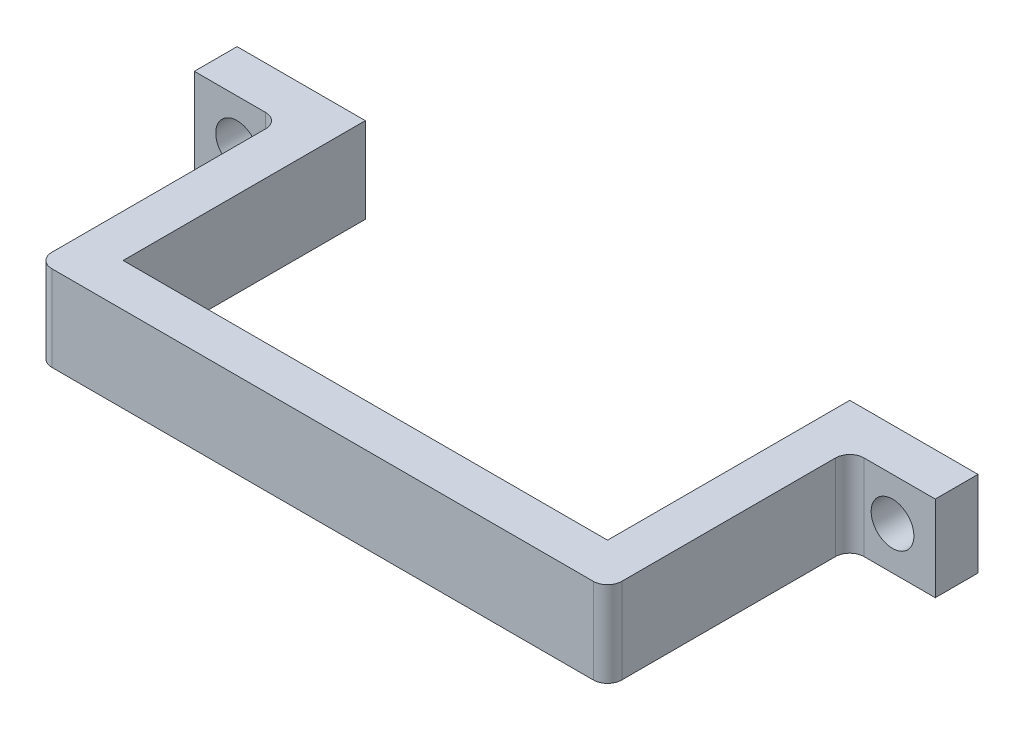
ISO-10303-21;
HEADER;
FILE_DESCRIPTION(('STEP AP214'),'2;1');
FILE_NAME('part.step','',(''),(''),'','','');
FILE_SCHEMA(('AUTOMOTIVE_DESIGN { 1 0 10303 214 1 1 1 1 }'));
ENDSEC;
DATA;
#1=APPLICATION_CONTEXT('core data for automotive mechanical design processes');
#2=APPLICATION_PROTOCOL_DEFINITION('international standard','automotive_design',2000,#1);
#3=PRODUCT_CONTEXT('',#1,'mechanical');
#4=PRODUCT('Part','Part','',(#3));
#5=PRODUCT_RELATED_PRODUCT_CATEGORY('part','',(#4));
#6=PRODUCT_DEFINITION_FORMATION('','',#4);
#7=PRODUCT_DEFINITION_CONTEXT('part definition',#1,'design');
#8=PRODUCT_DEFINITION('design','',#6,#7);
#9=PRODUCT_DEFINITION_SHAPE('','',#8);
#10=(LENGTH_UNIT() NAMED_UNIT(*) SI_UNIT(.MILLI.,.METRE.));
#11=(NAMED_UNIT(*) PLANE_ANGLE_UNIT() SI_UNIT($,.RADIAN.));
#12=(NAMED_UNIT(*) SI_UNIT($,.STERADIAN.) SOLID_ANGLE_UNIT());
#13=UNCERTAINTY_MEASURE_WITH_UNIT(LENGTH_MEASURE(1.E-05),#10,'distance_accuracy_value','');
#14=(GEOMETRIC_REPRESENTATION_CONTEXT(3) GLOBAL_UNCERTAINTY_ASSIGNED_CONTEXT((#13)) GLOBAL_UNIT_ASSIGNED_CONTEXT((#10,
#11,#12)) REPRESENTATION_CONTEXT('',''));
#15=CARTESIAN_POINT('',(0.,0.,0.));
#16=DIRECTION('',(0.,0.,1.));
#17=DIRECTION('',(1.,0.,0.));
#18=AXIS2_PLACEMENT_3D('',#15,#16,#17);
#19=CARTESIAN_POINT('',(0.,6.,-18.9789272030651));
#20=DIRECTION('',(0.,0.,1.));
#21=DIRECTION('',(1.,0.,0.));
#22=AXIS2_PLACEMENT_3D('',#19,#20,#21);
#23=PLANE('',#22);
#24=CARTESIAN_POINT('',(-21.8716475095785,3.,-18.9789272030651));
#25=DIRECTION('',(0.,0.,1.));
#26=DIRECTION('',(1.,0.,0.));
#27=AXIS2_PLACEMENT_3D('',#24,#25,#26);
#28=CIRCLE('',#27,1.5);
#29=CARTESIAN_POINT('',(-20.3716475095785,3.,-18.9789272030651));
#30=VERTEX_POINT('',#29);
#31=EDGE_CURVE('E185',#30,#30,#28,.T.);
#32=ORIENTED_EDGE('',*,*,#31,.T.);
#33=EDGE_LOOP('',(#32));
#34=FACE_BOUND('',#33,.T.);
#35=DIRECTION('',(-1.,0.,0.));
#36=VECTOR('',#35,1.);
#37=CARTESIAN_POINT('',(0.,0.,-18.9789272030651));
#38=LINE('',#37,#36);
#39=CARTESIAN_POINT('',(-15.8716475095785,0.,-18.9789272030651));
#40=VERTEX_POINT('',#39);
#41=CARTESIAN_POINT('',(-24.8716475095785,0.,-18.9789272030651));
#42=VERTEX_POINT('',#41);
#43=EDGE_CURVE('E173',#40,#42,#38,.T.);
#44=ORIENTED_EDGE('',*,*,#43,.T.);
#45=DIRECTION('',(0.,-1.,0.));
#46=VECTOR('',#45,1.);
#47=CARTESIAN_POINT('',(-24.8716475095785,6.,-18.9789272030651));
#48=LINE('',#47,#46);
#49=CARTESIAN_POINT('',(-24.8716475095785,6.,-18.9789272030651));
#50=VERTEX_POINT('',#49);
#51=EDGE_CURVE('E153',#50,#42,#48,.T.);
#52=ORIENTED_EDGE('',*,*,#51,.F.);
#53=DIRECTION('',(-1.,0.,0.));
#54=VECTOR('',#53,1.);
#55=CARTESIAN_POINT('',(0.,6.,-18.9789272030651));
#56=LINE('',#55,#54);
#57=CARTESIAN_POINT('',(-15.8716475095785,6.,-18.9789272030651));
#58=VERTEX_POINT('',#57);
#59=EDGE_CURVE('E160',#58,#50,#56,.T.);
#60=ORIENTED_EDGE('',*,*,#59,.F.);
#61=DIRECTION('',(0.,-1.,0.));
#62=VECTOR('',#61,1.);
#63=CARTESIAN_POINT('',(-15.8716475095785,6.,-18.9789272030651));
#64=LINE('',#63,#62);
#65=EDGE_CURVE('E251',#58,#40,#64,.T.);
#66=ORIENTED_EDGE('',*,*,#65,.T.);
#67=EDGE_LOOP('',(#44,#52,#60,#66));
#68=FACE_BOUND('',#67,.T.);
#69=ADVANCED_FACE('F36',(#34,#68),#23,.F.);
#70=CARTESIAN_POINT('',(-24.8716475095785,6.,0.));
#71=DIRECTION('',(1.,0.,0.));
#72=DIRECTION('',(0.,0.,-1.));
#73=AXIS2_PLACEMENT_3D('',#70,#71,#72);
#74=PLANE('',#73);
#75=DIRECTION('',(0.,0.,1.));
#76=VECTOR('',#75,1.);
#77=CARTESIAN_POINT('',(-24.8716475095785,0.,0.));
#78=LINE('',#77,#76);
#79=CARTESIAN_POINT('',(-24.8716475095785,0.,-15.9789272030651));
#80=VERTEX_POINT('',#79);
#81=EDGE_CURVE('E294',#42,#80,#78,.T.);
#82=ORIENTED_EDGE('',*,*,#81,.T.);
#83=DIRECTION('',(0.,-1.,0.));
#84=VECTOR('',#83,1.);
#85=CARTESIAN_POINT('',(-24.8716475095785,6.,-15.9789272030651));
#86=LINE('',#85,#84);
#87=CARTESIAN_POINT('',(-24.8716475095785,6.,-15.9789272030651));
#88=VERTEX_POINT('',#87);
#89=EDGE_CURVE('E156',#88,#80,#86,.T.);
#90=ORIENTED_EDGE('',*,*,#89,.F.);
#91=DIRECTION('',(0.,0.,1.));
#92=VECTOR('',#91,1.);
#93=CARTESIAN_POINT('',(-24.8716475095785,6.,0.));
#94=LINE('',#93,#92);
#95=EDGE_CURVE('E148',#50,#88,#94,.T.);
#96=ORIENTED_EDGE('',*,*,#95,.F.);
#97=ORIENTED_EDGE('',*,*,#51,.T.);
#98=EDGE_LOOP('',(#82,#90,#96,#97));
#99=FACE_BOUND('',#98,.T.);
#100=ADVANCED_FACE('F151',(#99),#74,.F.);
#101=CARTESIAN_POINT('',(0.,6.,-15.9789272030651));
#102=DIRECTION('',(0.,0.,1.));
#103=DIRECTION('',(1.,0.,0.));
#104=AXIS2_PLACEMENT_3D('',#101,#102,#103);
#105=PLANE('',#104);
#106=CARTESIAN_POINT('',(-21.8716475095785,3.,-15.9789272030651));
#107=DIRECTION('',(0.,0.,1.));
#108=DIRECTION('',(1.,0.,0.));
#109=AXIS2_PLACEMENT_3D('',#106,#107,#108);
#110=CIRCLE('',#109,1.5);
#111=CARTESIAN_POINT('',(-20.3716475095785,3.,-15.9789272030651));
#112=VERTEX_POINT('',#111);
#113=EDGE_CURVE('E186',#112,#112,#110,.T.);
#114=ORIENTED_EDGE('',*,*,#113,.F.);
#115=EDGE_LOOP('',(#114));
#116=FACE_BOUND('',#115,.T.);
#117=DIRECTION('',(-1.,0.,0.));
#118=VECTOR('',#117,1.);
#119=CARTESIAN_POINT('',(0.,0.,-15.9789272030651));
#120=LINE('',#119,#118);
#121=CARTESIAN_POINT('',(-19.8716475095785,0.,-15.9789272030651));
#122=VERTEX_POINT('',#121);
#123=EDGE_CURVE('E233',#122,#80,#120,.T.);
#124=ORIENTED_EDGE('',*,*,#123,.F.);
#125=DIRECTION('',(0.,-1.,0.));
#126=VECTOR('',#125,1.);
#127=CARTESIAN_POINT('',(-19.8716475095785,6.,-15.9789272030651));
#128=LINE('',#127,#126);
#129=CARTESIAN_POINT('',(-19.8716475095785,6.,-15.9789272030651));
#130=VERTEX_POINT('',#129);
#131=EDGE_CURVE('E177',#122,#130,#128,.F.);
#132=ORIENTED_EDGE('',*,*,#131,.T.);
#133=DIRECTION('',(-1.,0.,0.));
#134=VECTOR('',#133,1.);
#135=CARTESIAN_POINT('',(0.,6.,-15.9789272030651));
#136=LINE('',#135,#134);
#137=EDGE_CURVE('E159',#130,#88,#136,.T.);
#138=ORIENTED_EDGE('',*,*,#137,.T.);
#139=ORIENTED_EDGE('',*,*,#89,.T.);
#140=EDGE_LOOP('',(#124,#132,#138,#139));
#141=FACE_BOUND('',#140,.T.);
#142=ADVANCED_FACE('F299',(#116,#141),#105,.T.);
#143=CARTESIAN_POINT('',(-18.8716475095785,6.,0.));
#144=DIRECTION('',(-1.,0.,0.));
#145=DIRECTION('',(0.,0.,1.));
#146=AXIS2_PLACEMENT_3D('',#143,#144,#145);
#147=PLANE('',#146);
#148=DIRECTION('',(0.,0.,-1.));
#149=VECTOR('',#148,1.);
#150=CARTESIAN_POINT('',(-18.8716475095785,0.,0.));
#151=LINE('',#150,#149);
#152=CARTESIAN_POINT('',(-18.8716475095785,0.,0.0210727969348651));
#153=VERTEX_POINT('',#152);
#154=CARTESIAN_POINT('',(-18.8716475095785,0.,-14.9789272030651));
#155=VERTEX_POINT('',#154);
#156=EDGE_CURVE('E229',#153,#155,#151,.T.);
#157=ORIENTED_EDGE('',*,*,#156,.F.);
#158=DIRECTION('',(0.,-1.,0.));
#159=VECTOR('',#158,1.);
#160=CARTESIAN_POINT('',(-18.8716475095785,6.,0.0210727969348651));
#161=LINE('',#160,#159);
#162=CARTESIAN_POINT('',(-18.8716475095785,6.,0.0210727969348651));
#163=VERTEX_POINT('',#162);
#164=EDGE_CURVE('E44',#153,#163,#161,.F.);
#165=ORIENTED_EDGE('',*,*,#164,.T.);
#166=DIRECTION('',(0.,0.,-1.));
#167=VECTOR('',#166,1.);
#168=CARTESIAN_POINT('',(-18.8716475095785,6.,0.));
#169=LINE('',#168,#167);
#170=CARTESIAN_POINT('',(-18.8716475095785,6.,-14.9789272030651));
#171=VERTEX_POINT('',#170);
#172=EDGE_CURVE('E301',#163,#171,#169,.T.);
#173=ORIENTED_EDGE('',*,*,#172,.T.);
#174=DIRECTION('',(0.,-1.,0.));
#175=VECTOR('',#174,1.);
#176=CARTESIAN_POINT('',(-18.8716475095785,0.,-14.9789272030651));
#177=LINE('',#176,#175);
#178=EDGE_CURVE('E174',#171,#155,#177,.T.);
#179=ORIENTED_EDGE('',*,*,#178,.T.);
#180=EDGE_LOOP('',(#157,#165,#173,#179));
#181=FACE_BOUND('',#180,.T.);
#182=ADVANCED_FACE('F356',(#181),#147,.T.);
#183=CARTESIAN_POINT('',(0.,6.,1.02107279693487));
#184=DIRECTION('',(0.,0.,-1.));
#185=DIRECTION('',(-1.,0.,0.));
#186=AXIS2_PLACEMENT_3D('',#183,#184,#185);
#187=PLANE('',#186);
#188=DIRECTION('',(1.,0.,0.));
#189=VECTOR('',#188,1.);
#190=CARTESIAN_POINT('',(0.,6.,1.02107279693487));
#191=LINE('',#190,#189);
#192=CARTESIAN_POINT('',(-17.8716475095785,6.,1.02107279693487));
#193=VERTEX_POINT('',#192);
#194=CARTESIAN_POINT('',(20.1283524904215,6.,1.02107279693487));
#195=VERTEX_POINT('',#194);
#196=EDGE_CURVE('E222',#193,#195,#191,.T.);
#197=ORIENTED_EDGE('',*,*,#196,.F.);
#198=DIRECTION('',(0.,-1.,0.));
#199=VECTOR('',#198,1.);
#200=CARTESIAN_POINT('',(-17.8716475095785,0.,1.02107279693487));
#201=LINE('',#200,#199);
#202=CARTESIAN_POINT('',(-17.8716475095785,0.,1.02107279693487));
#203=VERTEX_POINT('',#202);
#204=EDGE_CURVE('E214',#193,#203,#201,.T.);
#205=ORIENTED_EDGE('',*,*,#204,.T.);
#206=DIRECTION('',(1.,0.,0.));
#207=VECTOR('',#206,1.);
#208=CARTESIAN_POINT('',(0.,0.,1.02107279693487));
#209=LINE('',#208,#207);
#210=CARTESIAN_POINT('',(20.1283524904215,0.,1.02107279693487));
#211=VERTEX_POINT('',#210);
#212=EDGE_CURVE('E221',#203,#211,#209,.T.);
#213=ORIENTED_EDGE('',*,*,#212,.T.);
#214=DIRECTION('',(0.,-1.,0.));
#215=VECTOR('',#214,1.);
#216=CARTESIAN_POINT('',(20.1283524904215,6.,1.02107279693487));
#217=LINE('',#216,#215);
#218=EDGE_CURVE('E209',#211,#195,#217,.F.);
#219=ORIENTED_EDGE('',*,*,#218,.T.);
#220=EDGE_LOOP('',(#197,#205,#213,#219));
#221=FACE_BOUND('',#220,.T.);
#222=ADVANCED_FACE('F220',(#221),#187,.F.);
#223=CARTESIAN_POINT('',(21.1283524904215,6.,0.));
#224=DIRECTION('',(1.,0.,0.));
#225=DIRECTION('',(0.,0.,-1.));
#226=AXIS2_PLACEMENT_3D('',#223,#224,#225);
#227=PLANE('',#226);
#228=DIRECTION('',(0.,0.,1.));
#229=VECTOR('',#228,1.);
#230=CARTESIAN_POINT('',(21.1283524904215,6.,0.));
#231=LINE('',#230,#229);
#232=CARTESIAN_POINT('',(21.1283524904215,6.,-14.9789272030651));
#233=VERTEX_POINT('',#232);
#234=CARTESIAN_POINT('',(21.1283524904215,6.,0.0210727969348651));
#235=VERTEX_POINT('',#234);
#236=EDGE_CURVE('E284',#233,#235,#231,.T.);
#237=ORIENTED_EDGE('',*,*,#236,.T.);
#238=DIRECTION('',(0.,-1.,0.));
#239=VECTOR('',#238,1.);
#240=CARTESIAN_POINT('',(21.1283524904215,0.,0.0210727969348651));
#241=LINE('',#240,#239);
#242=CARTESIAN_POINT('',(21.1283524904215,0.,0.0210727969348651));
#243=VERTEX_POINT('',#242);
#244=EDGE_CURVE('E203',#235,#243,#241,.T.);
#245=ORIENTED_EDGE('',*,*,#244,.T.);
#246=DIRECTION('',(0.,0.,1.));
#247=VECTOR('',#246,1.);
#248=CARTESIAN_POINT('',(21.1283524904215,0.,0.));
#249=LINE('',#248,#247);
#250=CARTESIAN_POINT('',(21.1283524904215,0.,-14.9789272030651));
#251=VERTEX_POINT('',#250);
#252=EDGE_CURVE('E228',#251,#243,#249,.T.);
#253=ORIENTED_EDGE('',*,*,#252,.F.);
#254=DIRECTION('',(0.,-1.,0.));
#255=VECTOR('',#254,1.);
#256=CARTESIAN_POINT('',(21.1283524904215,6.,-14.9789272030651));
#257=LINE('',#256,#255);
#258=EDGE_CURVE('E197',#251,#233,#257,.F.);
#259=ORIENTED_EDGE('',*,*,#258,.T.);
#260=EDGE_LOOP('',(#237,#245,#253,#259));
#261=FACE_BOUND('',#260,.T.);
#262=ADVANCED_FACE('F309',(#261),#227,.T.);
#263=CARTESIAN_POINT('',(0.,6.,-15.9789272030651));
#264=DIRECTION('',(0.,0.,-1.));
#265=DIRECTION('',(-1.,0.,0.));
#266=AXIS2_PLACEMENT_3D('',#263,#264,#265);
#267=PLANE('',#266);
#268=CARTESIAN_POINT('',(24.1283524904215,3.,-15.9789272030651));
#269=DIRECTION('',(0.,0.,1.));
#270=DIRECTION('',(1.,0.,0.));
#271=AXIS2_PLACEMENT_3D('',#268,#269,#270);
#272=CIRCLE('',#271,1.5);
#273=CARTESIAN_POINT('',(25.6283524904215,3.,-15.9789272030651));
#274=VERTEX_POINT('',#273);
#275=EDGE_CURVE('E365',#274,#274,#272,.T.);
#276=ORIENTED_EDGE('',*,*,#275,.F.);
#277=EDGE_LOOP('',(#276));
#278=FACE_BOUND('',#277,.T.);
#279=DIRECTION('',(1.,0.,0.));
#280=VECTOR('',#279,1.);
#281=CARTESIAN_POINT('',(0.,6.,-15.9789272030651));
#282=LINE('',#281,#280);
#283=CARTESIAN_POINT('',(22.1283524904215,6.,-15.9789272030651));
#284=VERTEX_POINT('',#283);
#285=CARTESIAN_POINT('',(27.1283524904215,6.,-15.9789272030651));
#286=VERTEX_POINT('',#285);
#287=EDGE_CURVE('E282',#284,#286,#282,.T.);
#288=ORIENTED_EDGE('',*,*,#287,.F.);
#289=DIRECTION('',(0.,-1.,0.));
#290=VECTOR('',#289,1.);
#291=CARTESIAN_POINT('',(22.1283524904215,6.,-15.9789272030651));
#292=LINE('',#291,#290);
#293=CARTESIAN_POINT('',(22.1283524904215,0.,-15.9789272030651));
#294=VERTEX_POINT('',#293);
#295=EDGE_CURVE('E194',#284,#294,#292,.T.);
#296=ORIENTED_EDGE('',*,*,#295,.T.);
#297=DIRECTION('',(1.,0.,0.));
#298=VECTOR('',#297,1.);
#299=CARTESIAN_POINT('',(0.,0.,-15.9789272030651));
#300=LINE('',#299,#298);
#301=CARTESIAN_POINT('',(27.1283524904215,0.,-15.9789272030651));
#302=VERTEX_POINT('',#301);
#303=EDGE_CURVE('E231',#294,#302,#300,.T.);
#304=ORIENTED_EDGE('',*,*,#303,.T.);
#305=DIRECTION('',(0.,-1.,0.));
#306=VECTOR('',#305,1.);
#307=CARTESIAN_POINT('',(27.1283524904215,6.,-15.9789272030651));
#308=LINE('',#307,#306);
#309=EDGE_CURVE('E179',#286,#302,#308,.T.);
#310=ORIENTED_EDGE('',*,*,#309,.F.);
#311=EDGE_LOOP('',(#288,#296,#304,#310));
#312=FACE_BOUND('',#311,.T.);
#313=ADVANCED_FACE('F341',(#278,#312),#267,.F.);
#314=CARTESIAN_POINT('',(27.1283524904215,6.,0.));
#315=DIRECTION('',(1.,0.,0.));
#316=DIRECTION('',(0.,0.,-1.));
#317=AXIS2_PLACEMENT_3D('',#314,#315,#316);
#318=PLANE('',#317);
#319=DIRECTION('',(0.,0.,1.));
#320=VECTOR('',#319,1.);
#321=CARTESIAN_POINT('',(27.1283524904215,0.,0.));
#322=LINE('',#321,#320);
#323=CARTESIAN_POINT('',(27.1283524904215,0.,-18.9789272030651));
#324=VERTEX_POINT('',#323);
#325=EDGE_CURVE('E238',#324,#302,#322,.T.);
#326=ORIENTED_EDGE('',*,*,#325,.F.);
#327=DIRECTION('',(0.,-1.,0.));
#328=VECTOR('',#327,1.);
#329=CARTESIAN_POINT('',(27.1283524904215,6.,-18.9789272030651));
#330=LINE('',#329,#328);
#331=CARTESIAN_POINT('',(27.1283524904215,6.,-18.9789272030651));
#332=VERTEX_POINT('',#331);
#333=EDGE_CURVE('E259',#332,#324,#330,.T.);
#334=ORIENTED_EDGE('',*,*,#333,.F.);
#335=DIRECTION('',(0.,0.,1.));
#336=VECTOR('',#335,1.);
#337=CARTESIAN_POINT('',(27.1283524904215,6.,0.));
#338=LINE('',#337,#336);
#339=EDGE_CURVE('E267',#332,#286,#338,.T.);
#340=ORIENTED_EDGE('',*,*,#339,.T.);
#341=ORIENTED_EDGE('',*,*,#309,.T.);
#342=EDGE_LOOP('',(#326,#334,#340,#341));
#343=FACE_BOUND('',#342,.T.);
#344=ADVANCED_FACE('F265',(#343),#318,.T.);
#345=CARTESIAN_POINT('',(0.,6.,-18.9789272030651));
#346=DIRECTION('',(0.,0.,1.));
#347=DIRECTION('',(1.,0.,0.));
#348=AXIS2_PLACEMENT_3D('',#345,#346,#347);
#349=PLANE('',#348);
#350=CARTESIAN_POINT('',(24.1283524904215,3.,-18.9789272030651));
#351=DIRECTION('',(0.,0.,1.));
#352=DIRECTION('',(1.,0.,0.));
#353=AXIS2_PLACEMENT_3D('',#350,#351,#352);
#354=CIRCLE('',#353,1.5);
#355=CARTESIAN_POINT('',(25.6283524904215,3.,-18.9789272030651));
#356=VERTEX_POINT('',#355);
#357=EDGE_CURVE('E183',#356,#356,#354,.T.);
#358=ORIENTED_EDGE('',*,*,#357,.T.);
#359=EDGE_LOOP('',(#358));
#360=FACE_BOUND('',#359,.T.);
#361=DIRECTION('',(-1.,0.,0.));
#362=VECTOR('',#361,1.);
#363=CARTESIAN_POINT('',(0.,0.,-18.9789272030651));
#364=LINE('',#363,#362);
#365=CARTESIAN_POINT('',(18.1283524904215,0.,-18.9789272030651));
#366=VERTEX_POINT('',#365);
#367=EDGE_CURVE('E241',#324,#366,#364,.T.);
#368=ORIENTED_EDGE('',*,*,#367,.T.);
#369=DIRECTION('',(0.,-1.,0.));
#370=VECTOR('',#369,1.);
#371=CARTESIAN_POINT('',(18.1283524904215,6.,-18.9789272030651));
#372=LINE('',#371,#370);
#373=CARTESIAN_POINT('',(18.1283524904215,6.,-18.9789272030651));
#374=VERTEX_POINT('',#373);
#375=EDGE_CURVE('E257',#374,#366,#372,.T.);
#376=ORIENTED_EDGE('',*,*,#375,.F.);
#377=DIRECTION('',(-1.,0.,0.));
#378=VECTOR('',#377,1.);
#379=CARTESIAN_POINT('',(0.,6.,-18.9789272030651));
#380=LINE('',#379,#378);
#381=EDGE_CURVE('E278',#332,#374,#380,.T.);
#382=ORIENTED_EDGE('',*,*,#381,.F.);
#383=ORIENTED_EDGE('',*,*,#333,.T.);
#384=EDGE_LOOP('',(#368,#376,#382,#383));
#385=FACE_BOUND('',#384,.T.);
#386=ADVANCED_FACE('F275',(#360,#385),#349,.F.);
#387=CARTESIAN_POINT('',(18.1283524904215,6.,0.));
#388=DIRECTION('',(-1.,0.,0.));
#389=DIRECTION('',(0.,0.,1.));
#390=AXIS2_PLACEMENT_3D('',#387,#388,#389);
#391=PLANE('',#390);
#392=DIRECTION('',(0.,0.,-1.));
#393=VECTOR('',#392,1.);
#394=CARTESIAN_POINT('',(18.1283524904215,0.,0.));
#395=LINE('',#394,#393);
#396=CARTESIAN_POINT('',(18.1283524904215,0.,-1.97892720306513));
#397=VERTEX_POINT('',#396);
#398=EDGE_CURVE('E244',#397,#366,#395,.T.);
#399=ORIENTED_EDGE('',*,*,#398,.F.);
#400=DIRECTION('',(0.,-1.,0.));
#401=VECTOR('',#400,1.);
#402=CARTESIAN_POINT('',(18.1283524904215,6.,-1.97892720306513));
#403=LINE('',#402,#401);
#404=CARTESIAN_POINT('',(18.1283524904215,6.,-1.97892720306513));
#405=VERTEX_POINT('',#404);
#406=EDGE_CURVE('E255',#405,#397,#403,.T.);
#407=ORIENTED_EDGE('',*,*,#406,.F.);
#408=DIRECTION('',(0.,0.,-1.));
#409=VECTOR('',#408,1.);
#410=CARTESIAN_POINT('',(18.1283524904215,6.,0.));
#411=LINE('',#410,#409);
#412=EDGE_CURVE('E280',#405,#374,#411,.T.);
#413=ORIENTED_EDGE('',*,*,#412,.T.);
#414=ORIENTED_EDGE('',*,*,#375,.T.);
#415=EDGE_LOOP('',(#399,#407,#413,#414));
#416=FACE_BOUND('',#415,.T.);
#417=ADVANCED_FACE('F392',(#416),#391,.T.);
#418=CARTESIAN_POINT('',(0.,6.,-1.97892720306513));
#419=DIRECTION('',(0.,0.,-1.));
#420=DIRECTION('',(-1.,0.,0.));
#421=AXIS2_PLACEMENT_3D('',#418,#419,#420);
#422=PLANE('',#421);
#423=DIRECTION('',(1.,0.,0.));
#424=VECTOR('',#423,1.);
#425=CARTESIAN_POINT('',(0.,0.,-1.97892720306513));
#426=LINE('',#425,#424);
#427=CARTESIAN_POINT('',(-15.8716475095785,0.,-1.97892720306513));
#428=VERTEX_POINT('',#427);
#429=EDGE_CURVE('E247',#428,#397,#426,.T.);
#430=ORIENTED_EDGE('',*,*,#429,.F.);
#431=DIRECTION('',(0.,-1.,0.));
#432=VECTOR('',#431,1.);
#433=CARTESIAN_POINT('',(-15.8716475095785,6.,-1.97892720306513));
#434=LINE('',#433,#432);
#435=CARTESIAN_POINT('',(-15.8716475095785,6.,-1.97892720306513));
#436=VERTEX_POINT('',#435);
#437=EDGE_CURVE('E253',#436,#428,#434,.T.);
#438=ORIENTED_EDGE('',*,*,#437,.F.);
#439=DIRECTION('',(1.,0.,0.));
#440=VECTOR('',#439,1.);
#441=CARTESIAN_POINT('',(0.,6.,-1.97892720306513));
#442=LINE('',#441,#440);
#443=EDGE_CURVE('E289',#436,#405,#442,.T.);
#444=ORIENTED_EDGE('',*,*,#443,.T.);
#445=ORIENTED_EDGE('',*,*,#406,.T.);
#446=EDGE_LOOP('',(#430,#438,#444,#445));
#447=FACE_BOUND('',#446,.T.);
#448=ADVANCED_FACE('F388',(#447),#422,.T.);
#449=CARTESIAN_POINT('',(-15.8716475095785,6.,0.));
#450=DIRECTION('',(-1.,0.,0.));
#451=DIRECTION('',(0.,0.,1.));
#452=AXIS2_PLACEMENT_3D('',#449,#450,#451);
#453=PLANE('',#452);
#454=DIRECTION('',(0.,0.,-1.));
#455=VECTOR('',#454,1.);
#456=CARTESIAN_POINT('',(-15.8716475095785,0.,0.));
#457=LINE('',#456,#455);
#458=EDGE_CURVE('E170',#428,#40,#457,.T.);
#459=ORIENTED_EDGE('',*,*,#458,.T.);
#460=ORIENTED_EDGE('',*,*,#65,.F.);
#461=DIRECTION('',(0.,0.,-1.));
#462=VECTOR('',#461,1.);
#463=CARTESIAN_POINT('',(-15.8716475095785,6.,0.));
#464=LINE('',#463,#462);
#465=EDGE_CURVE('E166',#436,#58,#464,.T.);
#466=ORIENTED_EDGE('',*,*,#465,.F.);
#467=ORIENTED_EDGE('',*,*,#437,.T.);
#468=EDGE_LOOP('',(#459,#460,#466,#467));
#469=FACE_BOUND('',#468,.T.);
#470=ADVANCED_FACE('F383',(#469),#453,.F.);
#471=CARTESIAN_POINT('',(0.,6.,0.));
#472=DIRECTION('',(0.,1.,0.));
#473=DIRECTION('',(0.,0.,1.));
#474=AXIS2_PLACEMENT_3D('',#471,#472,#473);
#475=PLANE('',#474);
#476=ORIENTED_EDGE('',*,*,#172,.F.);
#477=CARTESIAN_POINT('',(-17.8716475095785,6.,0.0210727969348651));
#478=DIRECTION('',(0.,1.,0.));
#479=DIRECTION('',(0.,0.,1.));
#480=AXIS2_PLACEMENT_3D('',#477,#478,#479);
#481=CIRCLE('',#480,1.);
#482=EDGE_CURVE('E11',#163,#193,#481,.T.);
#483=ORIENTED_EDGE('',*,*,#482,.T.);
#484=ORIENTED_EDGE('',*,*,#196,.T.);
#485=CARTESIAN_POINT('',(20.1283524904215,6.,0.0210727969348651));
#486=DIRECTION('',(0.,1.,0.));
#487=DIRECTION('',(0.,0.,1.));
#488=AXIS2_PLACEMENT_3D('',#485,#486,#487);
#489=CIRCLE('',#488,1.);
#490=EDGE_CURVE('E212',#195,#235,#489,.T.);
#491=ORIENTED_EDGE('',*,*,#490,.T.);
#492=ORIENTED_EDGE('',*,*,#236,.F.);
#493=CARTESIAN_POINT('',(22.1283524904215,6.,-14.9789272030651));
#494=DIRECTION('',(0.,1.,0.));
#495=DIRECTION('',(0.,0.,1.));
#496=AXIS2_PLACEMENT_3D('',#493,#494,#495);
#497=CIRCLE('',#496,1.);
#498=EDGE_CURVE('E201',#233,#284,#497,.F.);
#499=ORIENTED_EDGE('',*,*,#498,.T.);
#500=ORIENTED_EDGE('',*,*,#287,.T.);
#501=ORIENTED_EDGE('',*,*,#339,.F.);
#502=ORIENTED_EDGE('',*,*,#381,.T.);
#503=ORIENTED_EDGE('',*,*,#412,.F.);
#504=ORIENTED_EDGE('',*,*,#443,.F.);
#505=ORIENTED_EDGE('',*,*,#465,.T.);
#506=ORIENTED_EDGE('',*,*,#59,.T.);
#507=ORIENTED_EDGE('',*,*,#95,.T.);
#508=ORIENTED_EDGE('',*,*,#137,.F.);
#509=CARTESIAN_POINT('',(-19.8716475095785,6.,-14.9789272030651));
#510=DIRECTION('',(0.,1.,0.));
#511=DIRECTION('',(0.,0.,1.));
#512=AXIS2_PLACEMENT_3D('',#509,#510,#511);
#513=CIRCLE('',#512,1.);
#514=EDGE_CURVE('E191',#130,#171,#513,.F.);
#515=ORIENTED_EDGE('',*,*,#514,.T.);
#516=EDGE_LOOP('',(#476,#483,#484,#491,#492,#499,#500,#501,#502,#503,#504,#505,#506,#507,#508,#515));
#517=FACE_BOUND('',#516,.T.);
#518=ADVANCED_FACE('F163',(#517),#475,.T.);
#519=CARTESIAN_POINT('',(0.,0.,0.));
#520=DIRECTION('',(0.,1.,0.));
#521=DIRECTION('',(0.,0.,1.));
#522=AXIS2_PLACEMENT_3D('',#519,#520,#521);
#523=PLANE('',#522);
#524=ORIENTED_EDGE('',*,*,#212,.F.);
#525=CARTESIAN_POINT('',(-17.8716475095785,0.,0.0210727969348651));
#526=DIRECTION('',(0.,1.,0.));
#527=DIRECTION('',(0.,0.,1.));
#528=AXIS2_PLACEMENT_3D('',#525,#526,#527);
#529=CIRCLE('',#528,1.);
#530=EDGE_CURVE('E58',#203,#153,#529,.F.);
#531=ORIENTED_EDGE('',*,*,#530,.T.);
#532=ORIENTED_EDGE('',*,*,#156,.T.);
#533=CARTESIAN_POINT('',(-19.8716475095785,0.,-14.9789272030651));
#534=DIRECTION('',(0.,1.,0.));
#535=DIRECTION('',(0.,0.,1.));
#536=AXIS2_PLACEMENT_3D('',#533,#534,#535);
#537=CIRCLE('',#536,1.);
#538=EDGE_CURVE('E189',#155,#122,#537,.T.);
#539=ORIENTED_EDGE('',*,*,#538,.T.);
#540=ORIENTED_EDGE('',*,*,#123,.T.);
#541=ORIENTED_EDGE('',*,*,#81,.F.);
#542=ORIENTED_EDGE('',*,*,#43,.F.);
#543=ORIENTED_EDGE('',*,*,#458,.F.);
#544=ORIENTED_EDGE('',*,*,#429,.T.);
#545=ORIENTED_EDGE('',*,*,#398,.T.);
#546=ORIENTED_EDGE('',*,*,#367,.F.);
#547=ORIENTED_EDGE('',*,*,#325,.T.);
#548=ORIENTED_EDGE('',*,*,#303,.F.);
#549=CARTESIAN_POINT('',(22.1283524904215,0.,-14.9789272030651));
#550=DIRECTION('',(0.,1.,0.));
#551=DIRECTION('',(0.,0.,1.));
#552=AXIS2_PLACEMENT_3D('',#549,#550,#551);
#553=CIRCLE('',#552,1.);
#554=EDGE_CURVE('E199',#294,#251,#553,.T.);
#555=ORIENTED_EDGE('',*,*,#554,.T.);
#556=ORIENTED_EDGE('',*,*,#252,.T.);
#557=CARTESIAN_POINT('',(20.1283524904215,0.,0.0210727969348651));
#558=DIRECTION('',(0.,1.,0.));
#559=DIRECTION('',(0.,0.,1.));
#560=AXIS2_PLACEMENT_3D('',#557,#558,#559);
#561=CIRCLE('',#560,1.);
#562=EDGE_CURVE('E206',#243,#211,#561,.F.);
#563=ORIENTED_EDGE('',*,*,#562,.T.);
#564=EDGE_LOOP('',(#524,#531,#532,#539,#540,#541,#542,#543,#544,#545,#546,#547,#548,#555,#556,#563));
#565=FACE_BOUND('',#564,.T.);
#566=ADVANCED_FACE('F225',(#565),#523,.F.);
#567=CARTESIAN_POINT('',(24.1283524904215,3.,-21.9789272030651));
#568=DIRECTION('',(0.,0.,1.));
#569=DIRECTION('',(1.,0.,0.));
#570=AXIS2_PLACEMENT_3D('',#567,#568,#569);
#571=CYLINDRICAL_SURFACE('',#570,1.5);
#572=ORIENTED_EDGE('',*,*,#275,.T.);
#573=EDGE_LOOP('',(#572));
#574=FACE_BOUND('',#573,.T.);
#575=ORIENTED_EDGE('',*,*,#357,.F.);
#576=EDGE_LOOP('',(#575));
#577=FACE_BOUND('',#576,.T.);
#578=ADVANCED_FACE('F373',(#574,#577),#571,.F.);
#579=CARTESIAN_POINT('',(-21.8716475095785,3.,-21.9789272030651));
#580=DIRECTION('',(0.,0.,1.));
#581=DIRECTION('',(1.,0.,0.));
#582=AXIS2_PLACEMENT_3D('',#579,#580,#581);
#583=CYLINDRICAL_SURFACE('',#582,1.5);
#584=ORIENTED_EDGE('',*,*,#113,.T.);
#585=EDGE_LOOP('',(#584));
#586=FACE_BOUND('',#585,.T.);
#587=ORIENTED_EDGE('',*,*,#31,.F.);
#588=EDGE_LOOP('',(#587));
#589=FACE_BOUND('',#588,.T.);
#590=ADVANCED_FACE('F334',(#586,#589),#583,.F.);
#591=CARTESIAN_POINT('',(-19.8716475095785,6.,-14.9789272030651));
#592=DIRECTION('',(0.,1.,0.));
#593=DIRECTION('',(0.,0.,1.));
#594=AXIS2_PLACEMENT_3D('',#591,#592,#593);
#595=CYLINDRICAL_SURFACE('',#594,1.);
#596=ORIENTED_EDGE('',*,*,#514,.F.);
#597=ORIENTED_EDGE('',*,*,#131,.F.);
#598=ORIENTED_EDGE('',*,*,#538,.F.);
#599=ORIENTED_EDGE('',*,*,#178,.F.);
#600=EDGE_LOOP('',(#596,#597,#598,#599));
#601=FACE_BOUND('',#600,.T.);
#602=ADVANCED_FACE('F331',(#601),#595,.F.);
#603=CARTESIAN_POINT('',(22.1283524904215,6.,-14.9789272030651));
#604=DIRECTION('',(0.,-1.,0.));
#605=DIRECTION('',(0.,0.,-1.));
#606=AXIS2_PLACEMENT_3D('',#603,#604,#605);
#607=CYLINDRICAL_SURFACE('',#606,1.);
#608=ORIENTED_EDGE('',*,*,#498,.F.);
#609=ORIENTED_EDGE('',*,*,#258,.F.);
#610=ORIENTED_EDGE('',*,*,#554,.F.);
#611=ORIENTED_EDGE('',*,*,#295,.F.);
#612=EDGE_LOOP('',(#608,#609,#610,#611));
#613=FACE_BOUND('',#612,.T.);
#614=ADVANCED_FACE('F320',(#613),#607,.F.);
#615=CARTESIAN_POINT('',(20.1283524904215,6.,0.0210727969348651));
#616=DIRECTION('',(0.,1.,0.));
#617=DIRECTION('',(0.,0.,1.));
#618=AXIS2_PLACEMENT_3D('',#615,#616,#617);
#619=CYLINDRICAL_SURFACE('',#618,1.);
#620=ORIENTED_EDGE('',*,*,#490,.F.);
#621=ORIENTED_EDGE('',*,*,#218,.F.);
#622=ORIENTED_EDGE('',*,*,#562,.F.);
#623=ORIENTED_EDGE('',*,*,#244,.F.);
#624=EDGE_LOOP('',(#620,#621,#622,#623));
#625=FACE_BOUND('',#624,.T.);
#626=ADVANCED_FACE('F315',(#625),#619,.T.);
#627=CARTESIAN_POINT('',(-17.8716475095785,6.,0.0210727969348651));
#628=DIRECTION('',(0.,1.,0.));
#629=DIRECTION('',(0.,0.,1.));
#630=AXIS2_PLACEMENT_3D('',#627,#628,#629);
#631=CYLINDRICAL_SURFACE('',#630,1.);
#632=ORIENTED_EDGE('',*,*,#482,.F.);
#633=ORIENTED_EDGE('',*,*,#164,.F.);
#634=ORIENTED_EDGE('',*,*,#530,.F.);
#635=ORIENTED_EDGE('',*,*,#204,.F.);
#636=EDGE_LOOP('',(#632,#633,#634,#635));
#637=FACE_BOUND('',#636,.T.);
#638=ADVANCED_FACE('F38',(#637),#631,.T.);
#639=CLOSED_SHELL('',(#69,#100,#142,#182,#222,#262,#313,#344,#386,#417,#448,#470,#518,#566,#578,
#590,#602,#614,#626,#638));
#640=MANIFOLD_SOLID_BREP('B2',#639);
#641=ADVANCED_BREP_SHAPE_REPRESENTATION('',(#18,#640),#14);
#642=SHAPE_DEFINITION_REPRESENTATION(#9,#641);
ENDSEC;
END-ISO-10303-21;
